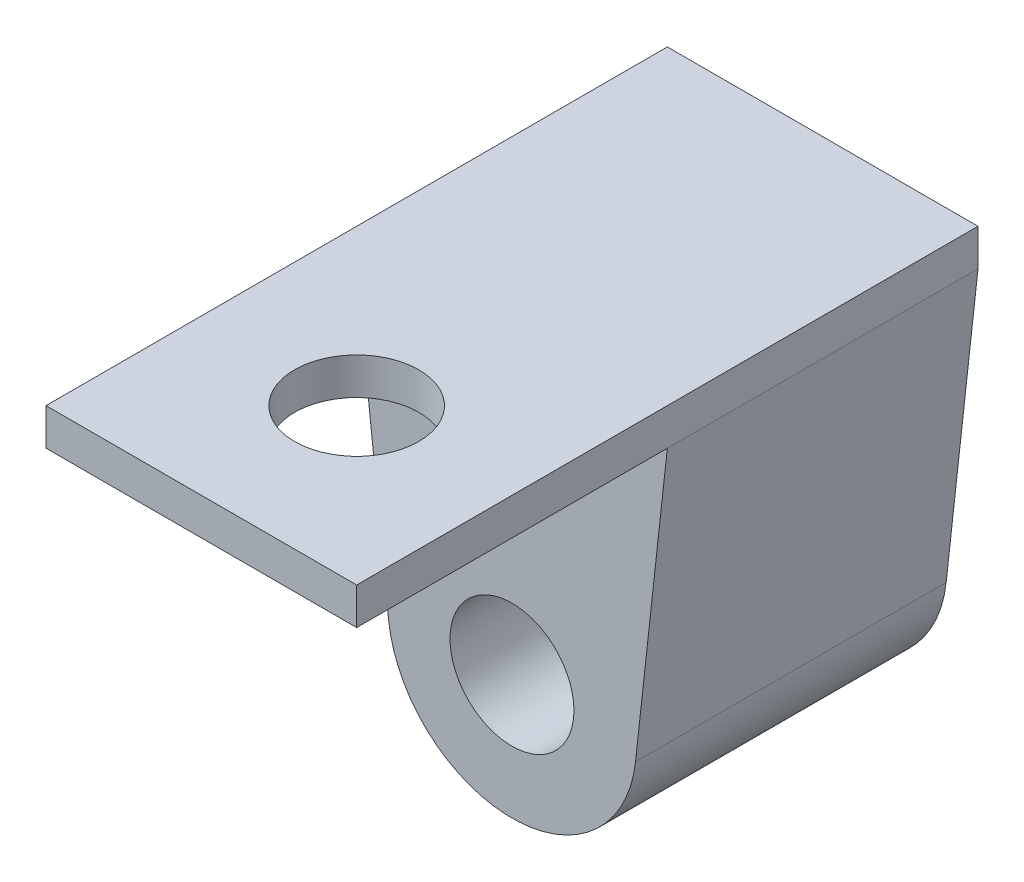
ISO-10303-21;
HEADER;
FILE_DESCRIPTION(('STEP AP214'),'2;1');
FILE_NAME('part.step','',(''),(''),'','','');
FILE_SCHEMA(('AUTOMOTIVE_DESIGN { 1 0 10303 214 1 1 1 1 }'));
ENDSEC;
DATA;
#1=APPLICATION_CONTEXT('core data for automotive mechanical design processes');
#2=APPLICATION_PROTOCOL_DEFINITION('international standard','automotive_design',2000,#1);
#3=PRODUCT_CONTEXT('',#1,'mechanical');
#4=PRODUCT('Part','Part','',(#3));
#5=PRODUCT_RELATED_PRODUCT_CATEGORY('part','',(#4));
#6=PRODUCT_DEFINITION_FORMATION('','',#4);
#7=PRODUCT_DEFINITION_CONTEXT('part definition',#1,'design');
#8=PRODUCT_DEFINITION('design','',#6,#7);
#9=PRODUCT_DEFINITION_SHAPE('','',#8);
#10=(LENGTH_UNIT() NAMED_UNIT(*) SI_UNIT(.MILLI.,.METRE.));
#11=(NAMED_UNIT(*) PLANE_ANGLE_UNIT() SI_UNIT($,.RADIAN.));
#12=(NAMED_UNIT(*) SI_UNIT($,.STERADIAN.) SOLID_ANGLE_UNIT());
#13=UNCERTAINTY_MEASURE_WITH_UNIT(LENGTH_MEASURE(1.E-05),#10,'distance_accuracy_value','');
#14=(GEOMETRIC_REPRESENTATION_CONTEXT(3) GLOBAL_UNCERTAINTY_ASSIGNED_CONTEXT((#13)) GLOBAL_UNIT_ASSIGNED_CONTEXT((#10,
#11,#12)) REPRESENTATION_CONTEXT('',''));
#15=CARTESIAN_POINT('',(0.,0.,0.));
#16=DIRECTION('',(0.,0.,1.));
#17=DIRECTION('',(1.,0.,0.));
#18=AXIS2_PLACEMENT_3D('',#15,#16,#17);
#19=CARTESIAN_POINT('',(-2.48744132566814,-0.27536105778,5.));
#20=DIRECTION('',(0.993928443766582,0.110028399387343,0.));
#21=DIRECTION('',(-0.110028399387343,0.993928443766582,0.));
#22=AXIS2_PLACEMENT_3D('',#19,#20,#21);
#23=PLANE('',#22);
#24=DIRECTION('',(0.110028399387343,-0.993928443766582,0.));
#25=VECTOR('',#24,1.);
#26=CARTESIAN_POINT('',(-2.48744132566814,-0.27536105778,0.));
#27=LINE('',#26,#25);
#28=CARTESIAN_POINT('',(-2.5,-0.161913768680612,0.));
#29=VERTEX_POINT('',#28);
#30=CARTESIAN_POINT('',(-1.98785688753316,-4.78829758953344,0.));
#31=VERTEX_POINT('',#30);
#32=EDGE_CURVE('E152',#29,#31,#27,.T.);
#33=ORIENTED_EDGE('',*,*,#32,.T.);
#34=DIRECTION('',(0.,0.,-1.));
#35=VECTOR('',#34,1.);
#36=CARTESIAN_POINT('',(-1.98785688753316,-4.78829758953344,5.));
#37=LINE('',#36,#35);
#38=CARTESIAN_POINT('',(-1.98785688753316,-4.78829758953344,5.));
#39=VERTEX_POINT('',#38);
#40=EDGE_CURVE('E11',#39,#31,#37,.T.);
#41=ORIENTED_EDGE('',*,*,#40,.F.);
#42=DIRECTION('',(0.110028399387343,-0.993928443766582,0.));
#43=VECTOR('',#42,1.);
#44=CARTESIAN_POINT('',(-2.48744132566814,-0.27536105778,5.));
#45=LINE('',#44,#43);
#46=CARTESIAN_POINT('',(-2.5,-0.161913768680612,5.));
#47=VERTEX_POINT('',#46);
#48=EDGE_CURVE('E143',#47,#39,#45,.T.);
#49=ORIENTED_EDGE('',*,*,#48,.F.);
#50=DIRECTION('',(0.,0.,-1.));
#51=VECTOR('',#50,1.);
#52=CARTESIAN_POINT('',(-2.5,-0.161913768680612,5.));
#53=LINE('',#52,#51);
#54=EDGE_CURVE('E83',#47,#29,#53,.T.);
#55=ORIENTED_EDGE('',*,*,#54,.T.);
#56=EDGE_LOOP('',(#33,#41,#49,#55));
#57=FACE_BOUND('',#56,.T.);
#58=ADVANCED_FACE('F35',(#57),#23,.F.);
#59=CARTESIAN_POINT('',(0.,-4.56824079075875,5.));
#60=DIRECTION('',(0.,0.,-1.));
#61=DIRECTION('',(-1.,0.,0.));
#62=AXIS2_PLACEMENT_3D('',#59,#60,#61);
#63=CYLINDRICAL_SURFACE('',#62,2.);
#64=CARTESIAN_POINT('',(0.,-4.56824079075875,0.));
#65=DIRECTION('',(0.,0.,1.));
#66=DIRECTION('',(1.,0.,0.));
#67=AXIS2_PLACEMENT_3D('',#64,#65,#66);
#68=CIRCLE('',#67,2.);
#69=CARTESIAN_POINT('',(1.98785688753316,-4.78829758953344,0.));
#70=VERTEX_POINT('',#69);
#71=EDGE_CURVE('E154',#31,#70,#68,.T.);
#72=ORIENTED_EDGE('',*,*,#71,.T.);
#73=DIRECTION('',(0.,0.,-1.));
#74=VECTOR('',#73,1.);
#75=CARTESIAN_POINT('',(1.98785688753316,-4.78829758953344,5.));
#76=LINE('',#75,#74);
#77=CARTESIAN_POINT('',(1.98785688753316,-4.78829758953344,5.));
#78=VERTEX_POINT('',#77);
#79=EDGE_CURVE('E44',#78,#70,#76,.T.);
#80=ORIENTED_EDGE('',*,*,#79,.F.);
#81=CARTESIAN_POINT('',(0.,-4.56824079075875,5.));
#82=DIRECTION('',(0.,0.,1.));
#83=DIRECTION('',(1.,0.,0.));
#84=AXIS2_PLACEMENT_3D('',#81,#82,#83);
#85=CIRCLE('',#84,2.);
#86=EDGE_CURVE('E88',#39,#78,#85,.T.);
#87=ORIENTED_EDGE('',*,*,#86,.F.);
#88=ORIENTED_EDGE('',*,*,#40,.T.);
#89=EDGE_LOOP('',(#72,#80,#87,#88));
#90=FACE_BOUND('',#89,.T.);
#91=ADVANCED_FACE('F171',(#90),#63,.T.);
#92=CARTESIAN_POINT('',(2.48744132566814,-0.27536105778,5.));
#93=DIRECTION('',(0.993928443766582,-0.110028399387343,0.));
#94=DIRECTION('',(0.110028399387343,0.993928443766582,0.));
#95=AXIS2_PLACEMENT_3D('',#92,#93,#94);
#96=PLANE('',#95);
#97=DIRECTION('',(-0.110028399387343,-0.993928443766582,0.));
#98=VECTOR('',#97,1.);
#99=CARTESIAN_POINT('',(2.48744132566814,-0.27536105778,0.));
#100=LINE('',#99,#98);
#101=CARTESIAN_POINT('',(2.5,-0.161913768680612,0.));
#102=VERTEX_POINT('',#101);
#103=EDGE_CURVE('E157',#102,#70,#100,.T.);
#104=ORIENTED_EDGE('',*,*,#103,.F.);
#105=DIRECTION('',(0.,0.,-1.));
#106=VECTOR('',#105,1.);
#107=CARTESIAN_POINT('',(2.5,-0.161913768680612,5.));
#108=LINE('',#107,#106);
#109=CARTESIAN_POINT('',(2.5,-0.161913768680612,5.));
#110=VERTEX_POINT('',#109);
#111=EDGE_CURVE('E114',#110,#102,#108,.T.);
#112=ORIENTED_EDGE('',*,*,#111,.F.);
#113=DIRECTION('',(-0.110028399387343,-0.993928443766582,0.));
#114=VECTOR('',#113,1.);
#115=CARTESIAN_POINT('',(2.48744132566814,-0.27536105778,5.));
#116=LINE('',#115,#114);
#117=EDGE_CURVE('E147',#110,#78,#116,.T.);
#118=ORIENTED_EDGE('',*,*,#117,.T.);
#119=ORIENTED_EDGE('',*,*,#79,.T.);
#120=EDGE_LOOP('',(#104,#112,#118,#119));
#121=FACE_BOUND('',#120,.T.);
#122=ADVANCED_FACE('F169',(#121),#96,.T.);
#123=CARTESIAN_POINT('',(2.5,0.,5.));
#124=DIRECTION('',(-1.,0.,0.));
#125=DIRECTION('',(0.,0.,1.));
#126=AXIS2_PLACEMENT_3D('',#123,#124,#125);
#127=PLANE('',#126);
#128=DIRECTION('',(0.,1.,0.));
#129=VECTOR('',#128,1.);
#130=CARTESIAN_POINT('',(2.5,0.,0.));
#131=LINE('',#130,#129);
#132=CARTESIAN_POINT('',(2.5,0.431759209241248,0.));
#133=VERTEX_POINT('',#132);
#134=EDGE_CURVE('E111',#102,#133,#131,.T.);
#135=ORIENTED_EDGE('',*,*,#134,.T.);
#136=DIRECTION('',(0.,0.,-1.));
#137=VECTOR('',#136,1.);
#138=CARTESIAN_POINT('',(2.5,0.431759209241248,5.));
#139=LINE('',#138,#137);
#140=CARTESIAN_POINT('',(2.5,0.431759209241248,10.));
#141=VERTEX_POINT('',#140);
#142=EDGE_CURVE('E104',#141,#133,#139,.T.);
#143=ORIENTED_EDGE('',*,*,#142,.F.);
#144=DIRECTION('',(0.,1.,0.));
#145=VECTOR('',#144,1.);
#146=CARTESIAN_POINT('',(2.5,-0.161913768680612,10.));
#147=LINE('',#146,#145);
#148=CARTESIAN_POINT('',(2.5,-0.161913768680612,10.));
#149=VERTEX_POINT('',#148);
#150=EDGE_CURVE('E109',#149,#141,#147,.T.);
#151=ORIENTED_EDGE('',*,*,#150,.F.);
#152=DIRECTION('',(0.,0.,-1.));
#153=VECTOR('',#152,1.);
#154=CARTESIAN_POINT('',(2.5,-0.161913768680612,10.));
#155=LINE('',#154,#153);
#156=EDGE_CURVE('E133',#149,#110,#155,.T.);
#157=ORIENTED_EDGE('',*,*,#156,.T.);
#158=ORIENTED_EDGE('',*,*,#111,.T.);
#159=EDGE_LOOP('',(#135,#143,#151,#157,#158));
#160=FACE_BOUND('',#159,.T.);
#161=ADVANCED_FACE('F106',(#160),#127,.F.);
#162=CARTESIAN_POINT('',(0.,0.431759209241248,5.));
#163=DIRECTION('',(0.,1.,0.));
#164=DIRECTION('',(0.,0.,1.));
#165=AXIS2_PLACEMENT_3D('',#162,#163,#164);
#166=PLANE('',#165);
#167=CARTESIAN_POINT('',(0.,0.431759209241248,7.5));
#168=DIRECTION('',(0.,1.,0.));
#169=DIRECTION('',(0.,0.,1.));
#170=AXIS2_PLACEMENT_3D('',#167,#168,#169);
#171=CIRCLE('',#170,1.);
#172=CARTESIAN_POINT('',(0.,0.431759209241248,8.5));
#173=VERTEX_POINT('',#172);
#174=EDGE_CURVE('E127',#173,#173,#171,.T.);
#175=ORIENTED_EDGE('',*,*,#174,.F.);
#176=EDGE_LOOP('',(#175));
#177=FACE_BOUND('',#176,.T.);
#178=DIRECTION('',(1.,0.,0.));
#179=VECTOR('',#178,1.);
#180=CARTESIAN_POINT('',(0.,0.431759209241248,0.));
#181=LINE('',#180,#179);
#182=CARTESIAN_POINT('',(-2.5,0.431759209241248,0.));
#183=VERTEX_POINT('',#182);
#184=EDGE_CURVE('E161',#183,#133,#181,.T.);
#185=ORIENTED_EDGE('',*,*,#184,.F.);
#186=DIRECTION('',(0.,0.,-1.));
#187=VECTOR('',#186,1.);
#188=CARTESIAN_POINT('',(-2.5,0.431759209241248,5.));
#189=LINE('',#188,#187);
#190=CARTESIAN_POINT('',(-2.5,0.431759209241248,10.));
#191=VERTEX_POINT('',#190);
#192=EDGE_CURVE('E77',#191,#183,#189,.T.);
#193=ORIENTED_EDGE('',*,*,#192,.F.);
#194=DIRECTION('',(-1.,0.,0.));
#195=VECTOR('',#194,1.);
#196=CARTESIAN_POINT('',(2.5,0.431759209241248,10.));
#197=LINE('',#196,#195);
#198=EDGE_CURVE('E117',#141,#191,#197,.T.);
#199=ORIENTED_EDGE('',*,*,#198,.F.);
#200=ORIENTED_EDGE('',*,*,#142,.T.);
#201=EDGE_LOOP('',(#185,#193,#199,#200));
#202=FACE_BOUND('',#201,.T.);
#203=ADVANCED_FACE('F118',(#177,#202),#166,.T.);
#204=CARTESIAN_POINT('',(0.,-4.56824079075875,5.));
#205=DIRECTION('',(0.,0.,-1.));
#206=DIRECTION('',(-1.,0.,0.));
#207=AXIS2_PLACEMENT_3D('',#204,#205,#206);
#208=CYLINDRICAL_SURFACE('',#207,0.9975);
#209=CARTESIAN_POINT('',(0.,-4.56824079075875,5.));
#210=DIRECTION('',(0.,0.,1.));
#211=DIRECTION('',(1.,0.,0.));
#212=AXIS2_PLACEMENT_3D('',#209,#210,#211);
#213=CIRCLE('',#212,0.9975);
#214=CARTESIAN_POINT('',(0.9975,-4.56824079075875,5.));
#215=VERTEX_POINT('',#214);
#216=EDGE_CURVE('E140',#215,#215,#213,.T.);
#217=ORIENTED_EDGE('',*,*,#216,.T.);
#218=EDGE_LOOP('',(#217));
#219=FACE_BOUND('',#218,.T.);
#220=CARTESIAN_POINT('',(0.,-4.56824079075875,0.));
#221=DIRECTION('',(0.,0.,1.));
#222=DIRECTION('',(1.,0.,0.));
#223=AXIS2_PLACEMENT_3D('',#220,#221,#222);
#224=CIRCLE('',#223,0.9975);
#225=CARTESIAN_POINT('',(0.9975,-4.56824079075875,0.));
#226=VERTEX_POINT('',#225);
#227=EDGE_CURVE('E139',#226,#226,#224,.T.);
#228=ORIENTED_EDGE('',*,*,#227,.F.);
#229=EDGE_LOOP('',(#228));
#230=FACE_BOUND('',#229,.T.);
#231=ADVANCED_FACE('F37',(#219,#230),#208,.F.);
#232=CARTESIAN_POINT('',(-2.5,0.,5.));
#233=DIRECTION('',(-1.,0.,0.));
#234=DIRECTION('',(0.,0.,1.));
#235=AXIS2_PLACEMENT_3D('',#232,#233,#234);
#236=PLANE('',#235);
#237=DIRECTION('',(0.,1.,0.));
#238=VECTOR('',#237,1.);
#239=CARTESIAN_POINT('',(-2.5,0.,0.));
#240=LINE('',#239,#238);
#241=EDGE_CURVE('E144',#29,#183,#240,.T.);
#242=ORIENTED_EDGE('',*,*,#241,.F.);
#243=ORIENTED_EDGE('',*,*,#54,.F.);
#244=DIRECTION('',(0.,0.,-1.));
#245=VECTOR('',#244,1.);
#246=CARTESIAN_POINT('',(-2.5,-0.161913768680612,10.));
#247=LINE('',#246,#245);
#248=CARTESIAN_POINT('',(-2.5,-0.161913768680612,10.));
#249=VERTEX_POINT('',#248);
#250=EDGE_CURVE('E136',#249,#47,#247,.T.);
#251=ORIENTED_EDGE('',*,*,#250,.F.);
#252=DIRECTION('',(0.,-1.,0.));
#253=VECTOR('',#252,1.);
#254=CARTESIAN_POINT('',(-2.5,-0.161913768680612,10.));
#255=LINE('',#254,#253);
#256=EDGE_CURVE('E120',#191,#249,#255,.T.);
#257=ORIENTED_EDGE('',*,*,#256,.F.);
#258=ORIENTED_EDGE('',*,*,#192,.T.);
#259=EDGE_LOOP('',(#242,#243,#251,#257,#258));
#260=FACE_BOUND('',#259,.T.);
#261=ADVANCED_FACE('F175',(#260),#236,.T.);
#262=CARTESIAN_POINT('',(0.,0.,5.));
#263=DIRECTION('',(0.,0.,1.));
#264=DIRECTION('',(1.,0.,0.));
#265=AXIS2_PLACEMENT_3D('',#262,#263,#264);
#266=PLANE('',#265);
#267=DIRECTION('',(1.,0.,0.));
#268=VECTOR('',#267,1.);
#269=CARTESIAN_POINT('',(2.5,-0.161913768680612,5.));
#270=LINE('',#269,#268);
#271=EDGE_CURVE('E52',#47,#110,#270,.T.);
#272=ORIENTED_EDGE('',*,*,#271,.F.);
#273=ORIENTED_EDGE('',*,*,#48,.T.);
#274=ORIENTED_EDGE('',*,*,#86,.T.);
#275=ORIENTED_EDGE('',*,*,#117,.F.);
#276=EDGE_LOOP('',(#272,#273,#274,#275));
#277=FACE_BOUND('',#276,.T.);
#278=ORIENTED_EDGE('',*,*,#216,.F.);
#279=EDGE_LOOP('',(#278));
#280=FACE_BOUND('',#279,.T.);
#281=ADVANCED_FACE('F188',(#277,#280),#266,.T.);
#282=CARTESIAN_POINT('',(0.,0.,0.));
#283=DIRECTION('',(0.,0.,1.));
#284=DIRECTION('',(1.,0.,0.));
#285=AXIS2_PLACEMENT_3D('',#282,#283,#284);
#286=PLANE('',#285);
#287=ORIENTED_EDGE('',*,*,#227,.T.);
#288=EDGE_LOOP('',(#287));
#289=FACE_BOUND('',#288,.T.);
#290=ORIENTED_EDGE('',*,*,#32,.F.);
#291=ORIENTED_EDGE('',*,*,#241,.T.);
#292=ORIENTED_EDGE('',*,*,#184,.T.);
#293=ORIENTED_EDGE('',*,*,#134,.F.);
#294=ORIENTED_EDGE('',*,*,#103,.T.);
#295=ORIENTED_EDGE('',*,*,#71,.F.);
#296=EDGE_LOOP('',(#290,#291,#292,#293,#294,#295));
#297=FACE_BOUND('',#296,.T.);
#298=ADVANCED_FACE('F174',(#289,#297),#286,.F.);
#299=CARTESIAN_POINT('',(2.5,-0.161913768680612,10.));
#300=DIRECTION('',(0.,1.,0.));
#301=DIRECTION('',(-1.,0.,0.));
#302=AXIS2_PLACEMENT_3D('',#299,#300,#301);
#303=PLANE('',#302);
#304=CARTESIAN_POINT('',(0.,-0.161913768680612,7.5));
#305=DIRECTION('',(0.,-1.,0.));
#306=DIRECTION('',(1.,0.,0.));
#307=AXIS2_PLACEMENT_3D('',#304,#305,#306);
#308=CIRCLE('',#307,1.);
#309=CARTESIAN_POINT('',(1.,-0.161913768680612,7.5));
#310=VERTEX_POINT('',#309);
#311=EDGE_CURVE('E268',#310,#310,#308,.T.);
#312=ORIENTED_EDGE('',*,*,#311,.F.);
#313=EDGE_LOOP('',(#312));
#314=FACE_BOUND('',#313,.T.);
#315=ORIENTED_EDGE('',*,*,#271,.T.);
#316=ORIENTED_EDGE('',*,*,#156,.F.);
#317=DIRECTION('',(1.,0.,0.));
#318=VECTOR('',#317,1.);
#319=CARTESIAN_POINT('',(2.5,-0.161913768680612,10.));
#320=LINE('',#319,#318);
#321=EDGE_CURVE('E124',#249,#149,#320,.T.);
#322=ORIENTED_EDGE('',*,*,#321,.F.);
#323=ORIENTED_EDGE('',*,*,#250,.T.);
#324=EDGE_LOOP('',(#315,#316,#322,#323));
#325=FACE_BOUND('',#324,.T.);
#326=ADVANCED_FACE('F178',(#314,#325),#303,.F.);
#327=CARTESIAN_POINT('',(0.,0.,10.));
#328=DIRECTION('',(0.,0.,1.));
#329=DIRECTION('',(1.,0.,0.));
#330=AXIS2_PLACEMENT_3D('',#327,#328,#329);
#331=PLANE('',#330);
#332=ORIENTED_EDGE('',*,*,#150,.T.);
#333=ORIENTED_EDGE('',*,*,#198,.T.);
#334=ORIENTED_EDGE('',*,*,#256,.T.);
#335=ORIENTED_EDGE('',*,*,#321,.T.);
#336=EDGE_LOOP('',(#332,#333,#334,#335));
#337=FACE_BOUND('',#336,.T.);
#338=ADVANCED_FACE('F122',(#337),#331,.T.);
#339=CARTESIAN_POINT('',(0.,4.83808623131939,7.5));
#340=DIRECTION('',(0.,-1.,0.));
#341=DIRECTION('',(1.,0.,0.));
#342=AXIS2_PLACEMENT_3D('',#339,#340,#341);
#343=CYLINDRICAL_SURFACE('',#342,1.);
#344=ORIENTED_EDGE('',*,*,#174,.T.);
#345=EDGE_LOOP('',(#344));
#346=FACE_BOUND('',#345,.T.);
#347=ORIENTED_EDGE('',*,*,#311,.T.);
#348=EDGE_LOOP('',(#347));
#349=FACE_BOUND('',#348,.T.);
#350=ADVANCED_FACE('F186',(#346,#349),#343,.F.);
#351=CLOSED_SHELL('',(#58,#91,#122,#161,#203,#231,#261,#281,#298,#326,#338,#350));
#352=MANIFOLD_SOLID_BREP('B2',#351);
#353=ADVANCED_BREP_SHAPE_REPRESENTATION('',(#18,#352),#14);
#354=SHAPE_DEFINITION_REPRESENTATION(#9,#353);
ENDSEC;
END-ISO-10303-21;
